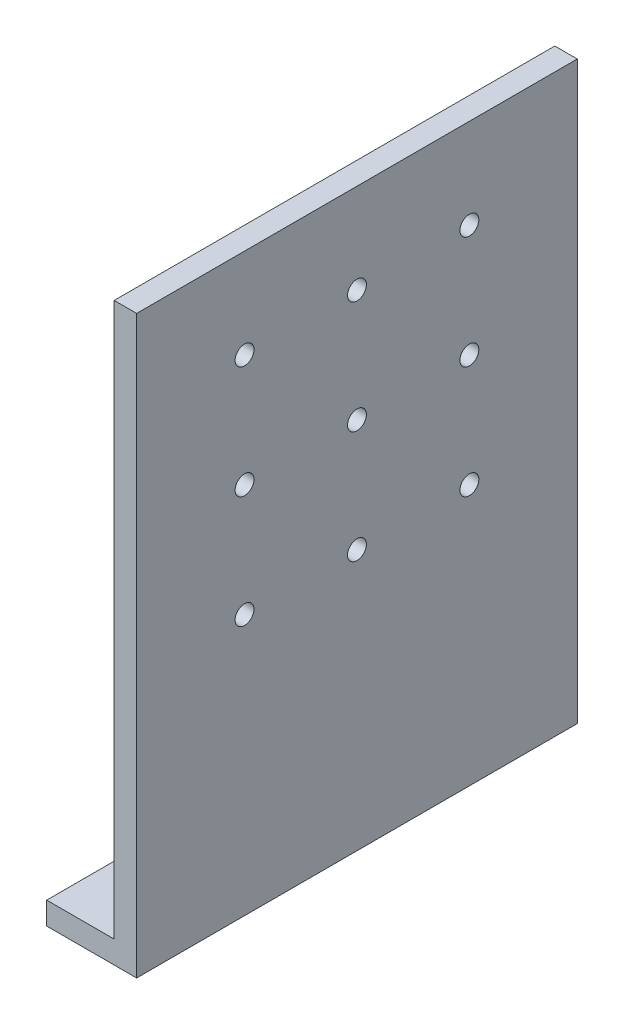
ISO-10303-21;
HEADER;
FILE_DESCRIPTION(('STEP AP214'),'2;1');
FILE_NAME('part.step','',(''),(''),'','','');
FILE_SCHEMA(('AUTOMOTIVE_DESIGN { 1 0 10303 214 1 1 1 1 }'));
ENDSEC;
DATA;
#1=APPLICATION_CONTEXT('core data for automotive mechanical design processes');
#2=APPLICATION_PROTOCOL_DEFINITION('international standard','automotive_design',2000,#1);
#3=PRODUCT_CONTEXT('',#1,'mechanical');
#4=PRODUCT('Part','Part','',(#3));
#5=PRODUCT_RELATED_PRODUCT_CATEGORY('part','',(#4));
#6=PRODUCT_DEFINITION_FORMATION('','',#4);
#7=PRODUCT_DEFINITION_CONTEXT('part definition',#1,'design');
#8=PRODUCT_DEFINITION('design','',#6,#7);
#9=PRODUCT_DEFINITION_SHAPE('','',#8);
#10=(LENGTH_UNIT() NAMED_UNIT(*) SI_UNIT(.MILLI.,.METRE.));
#11=(NAMED_UNIT(*) PLANE_ANGLE_UNIT() SI_UNIT($,.RADIAN.));
#12=(NAMED_UNIT(*) SI_UNIT($,.STERADIAN.) SOLID_ANGLE_UNIT());
#13=UNCERTAINTY_MEASURE_WITH_UNIT(LENGTH_MEASURE(1.E-05),#10,'distance_accuracy_value','');
#14=(GEOMETRIC_REPRESENTATION_CONTEXT(3) GLOBAL_UNCERTAINTY_ASSIGNED_CONTEXT((#13)) GLOBAL_UNIT_ASSIGNED_CONTEXT((#10,
#11,#12)) REPRESENTATION_CONTEXT('',''));
#15=CARTESIAN_POINT('',(0.,0.,0.));
#16=DIRECTION('',(0.,0.,1.));
#17=DIRECTION('',(1.,0.,0.));
#18=AXIS2_PLACEMENT_3D('',#15,#16,#17);
#19=CARTESIAN_POINT('',(-20.,0.,98.));
#20=DIRECTION('',(0.,1.,0.));
#21=DIRECTION('',(0.,0.,1.));
#22=AXIS2_PLACEMENT_3D('',#19,#20,#21);
#23=PLANE('',#22);
#24=CARTESIAN_POINT('',(-12.5,0.,24.));
#25=DIRECTION('',(0.,1.,0.));
#26=DIRECTION('',(0.,0.,1.));
#27=AXIS2_PLACEMENT_3D('',#24,#25,#26);
#28=CIRCLE('',#27,2.1);
#29=CARTESIAN_POINT('',(-12.5,0.,26.1));
#30=VERTEX_POINT('',#29);
#31=EDGE_CURVE('E187',#30,#30,#28,.T.);
#32=ORIENTED_EDGE('',*,*,#31,.T.);
#33=EDGE_LOOP('',(#32));
#34=FACE_BOUND('',#33,.T.);
#35=CARTESIAN_POINT('',(-12.5,0.,74.));
#36=DIRECTION('',(0.,1.,0.));
#37=DIRECTION('',(0.,0.,1.));
#38=AXIS2_PLACEMENT_3D('',#35,#36,#37);
#39=CIRCLE('',#38,2.1);
#40=CARTESIAN_POINT('',(-12.5,0.,76.1));
#41=VERTEX_POINT('',#40);
#42=EDGE_CURVE('E137',#41,#41,#39,.T.);
#43=ORIENTED_EDGE('',*,*,#42,.T.);
#44=EDGE_LOOP('',(#43));
#45=FACE_BOUND('',#44,.T.);
#46=DIRECTION('',(1.,0.,0.));
#47=VECTOR('',#46,1.);
#48=CARTESIAN_POINT('',(-20.,0.,0.));
#49=LINE('',#48,#47);
#50=CARTESIAN_POINT('',(-20.,0.,0.));
#51=VERTEX_POINT('',#50);
#52=CARTESIAN_POINT('',(0.,0.,0.));
#53=VERTEX_POINT('',#52);
#54=EDGE_CURVE('E132',#51,#53,#49,.T.);
#55=ORIENTED_EDGE('',*,*,#54,.T.);
#56=DIRECTION('',(0.,0.,-1.));
#57=VECTOR('',#56,1.);
#58=CARTESIAN_POINT('',(0.,0.,98.));
#59=LINE('',#58,#57);
#60=CARTESIAN_POINT('',(0.,0.,98.));
#61=VERTEX_POINT('',#60);
#62=EDGE_CURVE('E11',#61,#53,#59,.T.);
#63=ORIENTED_EDGE('',*,*,#62,.F.);
#64=DIRECTION('',(1.,0.,0.));
#65=VECTOR('',#64,1.);
#66=CARTESIAN_POINT('',(-20.,0.,98.));
#67=LINE('',#66,#65);
#68=CARTESIAN_POINT('',(-20.,0.,98.));
#69=VERTEX_POINT('',#68);
#70=EDGE_CURVE('E149',#69,#61,#67,.T.);
#71=ORIENTED_EDGE('',*,*,#70,.F.);
#72=DIRECTION('',(0.,0.,-1.));
#73=VECTOR('',#72,1.);
#74=CARTESIAN_POINT('',(-20.,0.,98.));
#75=LINE('',#74,#73);
#76=EDGE_CURVE('E128',#69,#51,#75,.T.);
#77=ORIENTED_EDGE('',*,*,#76,.T.);
#78=EDGE_LOOP('',(#55,#63,#71,#77));
#79=FACE_BOUND('',#78,.T.);
#80=ADVANCED_FACE('F43',(#34,#45,#79),#23,.F.);
#81=CARTESIAN_POINT('',(0.,0.,98.));
#82=DIRECTION('',(-1.,0.,0.));
#83=DIRECTION('',(0.,0.,1.));
#84=AXIS2_PLACEMENT_3D('',#81,#82,#83);
#85=PLANE('',#84);
#86=CARTESIAN_POINT('',(0.,58.,24.));
#87=DIRECTION('',(-1.,0.,0.));
#88=DIRECTION('',(0.,0.,1.));
#89=AXIS2_PLACEMENT_3D('',#86,#87,#88);
#90=CIRCLE('',#89,2.09999999999999);
#91=CARTESIAN_POINT('',(0.,58.,26.1));
#92=VERTEX_POINT('',#91);
#93=EDGE_CURVE('E273',#92,#92,#90,.T.);
#94=ORIENTED_EDGE('',*,*,#93,.T.);
#95=EDGE_LOOP('',(#94));
#96=FACE_BOUND('',#95,.T.);
#97=CARTESIAN_POINT('',(0.,58.,49.));
#98=DIRECTION('',(-1.,0.,0.));
#99=DIRECTION('',(0.,0.,1.));
#100=AXIS2_PLACEMENT_3D('',#97,#98,#99);
#101=CIRCLE('',#100,2.09999999999999);
#102=CARTESIAN_POINT('',(0.,58.,51.1));
#103=VERTEX_POINT('',#102);
#104=EDGE_CURVE('E265',#103,#103,#101,.T.);
#105=ORIENTED_EDGE('',*,*,#104,.T.);
#106=EDGE_LOOP('',(#105));
#107=FACE_BOUND('',#106,.T.);
#108=CARTESIAN_POINT('',(0.,58.,74.));
#109=DIRECTION('',(-1.,0.,0.));
#110=DIRECTION('',(0.,0.,1.));
#111=AXIS2_PLACEMENT_3D('',#108,#109,#110);
#112=CIRCLE('',#111,2.09999999999999);
#113=CARTESIAN_POINT('',(0.,58.,76.1));
#114=VERTEX_POINT('',#113);
#115=EDGE_CURVE('E257',#114,#114,#112,.T.);
#116=ORIENTED_EDGE('',*,*,#115,.T.);
#117=EDGE_LOOP('',(#116));
#118=FACE_BOUND('',#117,.T.);
#119=CARTESIAN_POINT('',(0.,83.,74.));
#120=DIRECTION('',(-1.,0.,0.));
#121=DIRECTION('',(0.,0.,1.));
#122=AXIS2_PLACEMENT_3D('',#119,#120,#121);
#123=CIRCLE('',#122,2.09999999999999);
#124=CARTESIAN_POINT('',(0.,83.,76.1));
#125=VERTEX_POINT('',#124);
#126=EDGE_CURVE('E249',#125,#125,#123,.T.);
#127=ORIENTED_EDGE('',*,*,#126,.T.);
#128=EDGE_LOOP('',(#127));
#129=FACE_BOUND('',#128,.T.);
#130=CARTESIAN_POINT('',(0.,108.,74.));
#131=DIRECTION('',(-1.,0.,0.));
#132=DIRECTION('',(0.,0.,1.));
#133=AXIS2_PLACEMENT_3D('',#130,#131,#132);
#134=CIRCLE('',#133,2.09999999999999);
#135=CARTESIAN_POINT('',(0.,108.,76.1));
#136=VERTEX_POINT('',#135);
#137=EDGE_CURVE('E241',#136,#136,#134,.T.);
#138=ORIENTED_EDGE('',*,*,#137,.T.);
#139=EDGE_LOOP('',(#138));
#140=FACE_BOUND('',#139,.T.);
#141=CARTESIAN_POINT('',(0.,108.,49.));
#142=DIRECTION('',(-1.,0.,0.));
#143=DIRECTION('',(0.,0.,1.));
#144=AXIS2_PLACEMENT_3D('',#141,#142,#143);
#145=CIRCLE('',#144,2.09999999999999);
#146=CARTESIAN_POINT('',(0.,108.,51.1));
#147=VERTEX_POINT('',#146);
#148=EDGE_CURVE('E233',#147,#147,#145,.T.);
#149=ORIENTED_EDGE('',*,*,#148,.T.);
#150=EDGE_LOOP('',(#149));
#151=FACE_BOUND('',#150,.T.);
#152=CARTESIAN_POINT('',(0.,108.,24.));
#153=DIRECTION('',(-1.,0.,0.));
#154=DIRECTION('',(0.,0.,1.));
#155=AXIS2_PLACEMENT_3D('',#152,#153,#154);
#156=CIRCLE('',#155,2.09999999999999);
#157=CARTESIAN_POINT('',(0.,108.,26.1));
#158=VERTEX_POINT('',#157);
#159=EDGE_CURVE('E225',#158,#158,#156,.T.);
#160=ORIENTED_EDGE('',*,*,#159,.T.);
#161=EDGE_LOOP('',(#160));
#162=FACE_BOUND('',#161,.T.);
#163=CARTESIAN_POINT('',(0.,83.,24.));
#164=DIRECTION('',(-1.,0.,0.));
#165=DIRECTION('',(0.,0.,1.));
#166=AXIS2_PLACEMENT_3D('',#163,#164,#165);
#167=CIRCLE('',#166,2.09999999999999);
#168=CARTESIAN_POINT('',(0.,83.,26.1));
#169=VERTEX_POINT('',#168);
#170=EDGE_CURVE('E217',#169,#169,#167,.T.);
#171=ORIENTED_EDGE('',*,*,#170,.T.);
#172=EDGE_LOOP('',(#171));
#173=FACE_BOUND('',#172,.T.);
#174=CARTESIAN_POINT('',(0.,83.,49.));
#175=DIRECTION('',(-1.,0.,0.));
#176=DIRECTION('',(0.,0.,1.));
#177=AXIS2_PLACEMENT_3D('',#174,#175,#176);
#178=CIRCLE('',#177,2.09999999999999);
#179=CARTESIAN_POINT('',(0.,83.,51.1));
#180=VERTEX_POINT('',#179);
#181=EDGE_CURVE('E209',#180,#180,#178,.T.);
#182=ORIENTED_EDGE('',*,*,#181,.T.);
#183=EDGE_LOOP('',(#182));
#184=FACE_BOUND('',#183,.T.);
#185=DIRECTION('',(0.,1.,0.));
#186=VECTOR('',#185,1.);
#187=CARTESIAN_POINT('',(0.,0.,0.));
#188=LINE('',#187,#186);
#189=CARTESIAN_POINT('',(0.,128.,0.));
#190=VERTEX_POINT('',#189);
#191=EDGE_CURVE('E136',#53,#190,#188,.T.);
#192=ORIENTED_EDGE('',*,*,#191,.T.);
#193=DIRECTION('',(0.,0.,-1.));
#194=VECTOR('',#193,1.);
#195=CARTESIAN_POINT('',(0.,128.,98.));
#196=LINE('',#195,#194);
#197=CARTESIAN_POINT('',(0.,128.,98.));
#198=VERTEX_POINT('',#197);
#199=EDGE_CURVE('E52',#198,#190,#196,.T.);
#200=ORIENTED_EDGE('',*,*,#199,.F.);
#201=DIRECTION('',(0.,1.,0.));
#202=VECTOR('',#201,1.);
#203=CARTESIAN_POINT('',(0.,0.,98.));
#204=LINE('',#203,#202);
#205=EDGE_CURVE('E97',#61,#198,#204,.T.);
#206=ORIENTED_EDGE('',*,*,#205,.F.);
#207=ORIENTED_EDGE('',*,*,#62,.T.);
#208=EDGE_LOOP('',(#192,#200,#206,#207));
#209=FACE_BOUND('',#208,.T.);
#210=ADVANCED_FACE('F178',(#96,#107,#118,#129,#140,#151,#162,#173,#184,#209),#85,.F.);
#211=CARTESIAN_POINT('',(0.,128.,98.));
#212=DIRECTION('',(0.,-1.,0.));
#213=DIRECTION('',(0.,0.,-1.));
#214=AXIS2_PLACEMENT_3D('',#211,#212,#213);
#215=PLANE('',#214);
#216=DIRECTION('',(-1.,0.,0.));
#217=VECTOR('',#216,1.);
#218=CARTESIAN_POINT('',(0.,128.,0.));
#219=LINE('',#218,#217);
#220=CARTESIAN_POINT('',(-5.,128.,0.));
#221=VERTEX_POINT('',#220);
#222=EDGE_CURVE('E140',#190,#221,#219,.T.);
#223=ORIENTED_EDGE('',*,*,#222,.T.);
#224=DIRECTION('',(0.,0.,-1.));
#225=VECTOR('',#224,1.);
#226=CARTESIAN_POINT('',(-5.,128.,98.));
#227=LINE('',#226,#225);
#228=CARTESIAN_POINT('',(-5.,128.,98.));
#229=VERTEX_POINT('',#228);
#230=EDGE_CURVE('E121',#229,#221,#227,.T.);
#231=ORIENTED_EDGE('',*,*,#230,.F.);
#232=DIRECTION('',(-1.,0.,0.));
#233=VECTOR('',#232,1.);
#234=CARTESIAN_POINT('',(0.,128.,98.));
#235=LINE('',#234,#233);
#236=EDGE_CURVE('E110',#198,#229,#235,.T.);
#237=ORIENTED_EDGE('',*,*,#236,.F.);
#238=ORIENTED_EDGE('',*,*,#199,.T.);
#239=EDGE_LOOP('',(#223,#231,#237,#238));
#240=FACE_BOUND('',#239,.T.);
#241=ADVANCED_FACE('F159',(#240),#215,.F.);
#242=CARTESIAN_POINT('',(-5.,128.,98.));
#243=DIRECTION('',(1.,0.,0.));
#244=DIRECTION('',(0.,1.,0.));
#245=AXIS2_PLACEMENT_3D('',#242,#243,#244);
#246=PLANE('',#245);
#247=CARTESIAN_POINT('',(-4.99999999999999,58.,24.));
#248=DIRECTION('',(-1.,0.,0.));
#249=DIRECTION('',(0.,0.,1.));
#250=AXIS2_PLACEMENT_3D('',#247,#248,#249);
#251=CIRCLE('',#250,2.09999999999999);
#252=CARTESIAN_POINT('',(-4.99999999999999,58.,26.1));
#253=VERTEX_POINT('',#252);
#254=EDGE_CURVE('E277',#253,#253,#251,.T.);
#255=ORIENTED_EDGE('',*,*,#254,.F.);
#256=EDGE_LOOP('',(#255));
#257=FACE_BOUND('',#256,.T.);
#258=CARTESIAN_POINT('',(-4.99999999999999,58.,49.));
#259=DIRECTION('',(-1.,0.,0.));
#260=DIRECTION('',(0.,0.,1.));
#261=AXIS2_PLACEMENT_3D('',#258,#259,#260);
#262=CIRCLE('',#261,2.09999999999999);
#263=CARTESIAN_POINT('',(-4.99999999999999,58.,51.1));
#264=VERTEX_POINT('',#263);
#265=EDGE_CURVE('E269',#264,#264,#262,.T.);
#266=ORIENTED_EDGE('',*,*,#265,.F.);
#267=EDGE_LOOP('',(#266));
#268=FACE_BOUND('',#267,.T.);
#269=CARTESIAN_POINT('',(-4.99999999999999,58.,74.));
#270=DIRECTION('',(-1.,0.,0.));
#271=DIRECTION('',(0.,0.,1.));
#272=AXIS2_PLACEMENT_3D('',#269,#270,#271);
#273=CIRCLE('',#272,2.09999999999999);
#274=CARTESIAN_POINT('',(-4.99999999999999,58.,76.1));
#275=VERTEX_POINT('',#274);
#276=EDGE_CURVE('E261',#275,#275,#273,.T.);
#277=ORIENTED_EDGE('',*,*,#276,.F.);
#278=EDGE_LOOP('',(#277));
#279=FACE_BOUND('',#278,.T.);
#280=CARTESIAN_POINT('',(-5.,83.,74.));
#281=DIRECTION('',(-1.,0.,0.));
#282=DIRECTION('',(0.,0.,1.));
#283=AXIS2_PLACEMENT_3D('',#280,#281,#282);
#284=CIRCLE('',#283,2.09999999999999);
#285=CARTESIAN_POINT('',(-5.,83.,76.1));
#286=VERTEX_POINT('',#285);
#287=EDGE_CURVE('E253',#286,#286,#284,.T.);
#288=ORIENTED_EDGE('',*,*,#287,.F.);
#289=EDGE_LOOP('',(#288));
#290=FACE_BOUND('',#289,.T.);
#291=CARTESIAN_POINT('',(-5.,108.,74.));
#292=DIRECTION('',(-1.,0.,0.));
#293=DIRECTION('',(0.,0.,1.));
#294=AXIS2_PLACEMENT_3D('',#291,#292,#293);
#295=CIRCLE('',#294,2.09999999999999);
#296=CARTESIAN_POINT('',(-5.,108.,76.1));
#297=VERTEX_POINT('',#296);
#298=EDGE_CURVE('E245',#297,#297,#295,.T.);
#299=ORIENTED_EDGE('',*,*,#298,.F.);
#300=EDGE_LOOP('',(#299));
#301=FACE_BOUND('',#300,.T.);
#302=CARTESIAN_POINT('',(-5.,108.,49.));
#303=DIRECTION('',(-1.,0.,0.));
#304=DIRECTION('',(0.,0.,1.));
#305=AXIS2_PLACEMENT_3D('',#302,#303,#304);
#306=CIRCLE('',#305,2.09999999999999);
#307=CARTESIAN_POINT('',(-5.,108.,51.1));
#308=VERTEX_POINT('',#307);
#309=EDGE_CURVE('E237',#308,#308,#306,.T.);
#310=ORIENTED_EDGE('',*,*,#309,.F.);
#311=EDGE_LOOP('',(#310));
#312=FACE_BOUND('',#311,.T.);
#313=CARTESIAN_POINT('',(-5.,108.,24.));
#314=DIRECTION('',(-1.,0.,0.));
#315=DIRECTION('',(0.,0.,1.));
#316=AXIS2_PLACEMENT_3D('',#313,#314,#315);
#317=CIRCLE('',#316,2.09999999999999);
#318=CARTESIAN_POINT('',(-5.,108.,26.1));
#319=VERTEX_POINT('',#318);
#320=EDGE_CURVE('E229',#319,#319,#317,.T.);
#321=ORIENTED_EDGE('',*,*,#320,.F.);
#322=EDGE_LOOP('',(#321));
#323=FACE_BOUND('',#322,.T.);
#324=CARTESIAN_POINT('',(-5.,83.,24.));
#325=DIRECTION('',(-1.,0.,0.));
#326=DIRECTION('',(0.,0.,1.));
#327=AXIS2_PLACEMENT_3D('',#324,#325,#326);
#328=CIRCLE('',#327,2.09999999999999);
#329=CARTESIAN_POINT('',(-5.,83.,26.1));
#330=VERTEX_POINT('',#329);
#331=EDGE_CURVE('E221',#330,#330,#328,.T.);
#332=ORIENTED_EDGE('',*,*,#331,.F.);
#333=EDGE_LOOP('',(#332));
#334=FACE_BOUND('',#333,.T.);
#335=CARTESIAN_POINT('',(-5.,83.,49.));
#336=DIRECTION('',(-1.,0.,0.));
#337=DIRECTION('',(0.,0.,1.));
#338=AXIS2_PLACEMENT_3D('',#335,#336,#337);
#339=CIRCLE('',#338,2.09999999999999);
#340=CARTESIAN_POINT('',(-5.,83.,51.1));
#341=VERTEX_POINT('',#340);
#342=EDGE_CURVE('E213',#341,#341,#339,.T.);
#343=ORIENTED_EDGE('',*,*,#342,.F.);
#344=EDGE_LOOP('',(#343));
#345=FACE_BOUND('',#344,.T.);
#346=DIRECTION('',(0.,-1.,0.));
#347=VECTOR('',#346,1.);
#348=CARTESIAN_POINT('',(-5.,128.,0.));
#349=LINE('',#348,#347);
#350=CARTESIAN_POINT('',(-4.99999999999998,5.,0.));
#351=VERTEX_POINT('',#350);
#352=EDGE_CURVE('E119',#221,#351,#349,.T.);
#353=ORIENTED_EDGE('',*,*,#352,.T.);
#354=DIRECTION('',(0.,0.,-1.));
#355=VECTOR('',#354,1.);
#356=CARTESIAN_POINT('',(-4.99999999999998,5.,98.));
#357=LINE('',#356,#355);
#358=CARTESIAN_POINT('',(-4.99999999999998,5.,98.));
#359=VERTEX_POINT('',#358);
#360=EDGE_CURVE('E116',#359,#351,#357,.T.);
#361=ORIENTED_EDGE('',*,*,#360,.F.);
#362=DIRECTION('',(0.,-1.,0.));
#363=VECTOR('',#362,1.);
#364=CARTESIAN_POINT('',(-5.,128.,98.));
#365=LINE('',#364,#363);
#366=EDGE_CURVE('E104',#229,#359,#365,.T.);
#367=ORIENTED_EDGE('',*,*,#366,.F.);
#368=ORIENTED_EDGE('',*,*,#230,.T.);
#369=EDGE_LOOP('',(#353,#361,#367,#368));
#370=FACE_BOUND('',#369,.T.);
#371=ADVANCED_FACE('F117',(#257,#268,#279,#290,#301,#312,#323,#334,#345,#370),#246,.F.);
#372=CARTESIAN_POINT('',(-4.99999999999998,5.,98.));
#373=DIRECTION('',(0.,-1.,0.));
#374=DIRECTION('',(1.,0.,0.));
#375=AXIS2_PLACEMENT_3D('',#372,#373,#374);
#376=PLANE('',#375);
#377=CARTESIAN_POINT('',(-12.5,5.,24.));
#378=DIRECTION('',(0.,1.,0.));
#379=DIRECTION('',(0.,0.,1.));
#380=AXIS2_PLACEMENT_3D('',#377,#378,#379);
#381=CIRCLE('',#380,2.1);
#382=CARTESIAN_POINT('',(-12.5,5.,26.1));
#383=VERTEX_POINT('',#382);
#384=EDGE_CURVE('E205',#383,#383,#381,.T.);
#385=ORIENTED_EDGE('',*,*,#384,.F.);
#386=EDGE_LOOP('',(#385));
#387=FACE_BOUND('',#386,.T.);
#388=CARTESIAN_POINT('',(-12.5,5.,74.));
#389=DIRECTION('',(0.,1.,0.));
#390=DIRECTION('',(0.,0.,1.));
#391=AXIS2_PLACEMENT_3D('',#388,#389,#390);
#392=CIRCLE('',#391,2.1);
#393=CARTESIAN_POINT('',(-12.5,5.,76.1));
#394=VERTEX_POINT('',#393);
#395=EDGE_CURVE('E192',#394,#394,#392,.T.);
#396=ORIENTED_EDGE('',*,*,#395,.F.);
#397=EDGE_LOOP('',(#396));
#398=FACE_BOUND('',#397,.T.);
#399=DIRECTION('',(-1.,0.,0.));
#400=VECTOR('',#399,1.);
#401=CARTESIAN_POINT('',(-4.99999999999998,5.,0.));
#402=LINE('',#401,#400);
#403=CARTESIAN_POINT('',(-20.,5.,0.));
#404=VERTEX_POINT('',#403);
#405=EDGE_CURVE('E83',#351,#404,#402,.T.);
#406=ORIENTED_EDGE('',*,*,#405,.T.);
#407=DIRECTION('',(0.,0.,-1.));
#408=VECTOR('',#407,1.);
#409=CARTESIAN_POINT('',(-20.,5.,98.));
#410=LINE('',#409,#408);
#411=CARTESIAN_POINT('',(-20.,5.,98.));
#412=VERTEX_POINT('',#411);
#413=EDGE_CURVE('E122',#412,#404,#410,.T.);
#414=ORIENTED_EDGE('',*,*,#413,.F.);
#415=DIRECTION('',(-1.,0.,0.));
#416=VECTOR('',#415,1.);
#417=CARTESIAN_POINT('',(-4.99999999999998,5.,98.));
#418=LINE('',#417,#416);
#419=EDGE_CURVE('E108',#359,#412,#418,.T.);
#420=ORIENTED_EDGE('',*,*,#419,.F.);
#421=ORIENTED_EDGE('',*,*,#360,.T.);
#422=EDGE_LOOP('',(#406,#414,#420,#421));
#423=FACE_BOUND('',#422,.T.);
#424=ADVANCED_FACE('F124',(#387,#398,#423),#376,.F.);
#425=CARTESIAN_POINT('',(-20.,5.,98.));
#426=DIRECTION('',(1.,0.,0.));
#427=DIRECTION('',(0.,1.,0.));
#428=AXIS2_PLACEMENT_3D('',#425,#426,#427);
#429=PLANE('',#428);
#430=DIRECTION('',(0.,-1.,0.));
#431=VECTOR('',#430,1.);
#432=CARTESIAN_POINT('',(-20.,5.,0.));
#433=LINE('',#432,#431);
#434=EDGE_CURVE('E89',#404,#51,#433,.T.);
#435=ORIENTED_EDGE('',*,*,#434,.T.);
#436=ORIENTED_EDGE('',*,*,#76,.F.);
#437=DIRECTION('',(0.,-1.,0.));
#438=VECTOR('',#437,1.);
#439=CARTESIAN_POINT('',(-20.,5.,98.));
#440=LINE('',#439,#438);
#441=EDGE_CURVE('E60',#412,#69,#440,.T.);
#442=ORIENTED_EDGE('',*,*,#441,.F.);
#443=ORIENTED_EDGE('',*,*,#413,.T.);
#444=EDGE_LOOP('',(#435,#436,#442,#443));
#445=FACE_BOUND('',#444,.T.);
#446=ADVANCED_FACE('F166',(#445),#429,.F.);
#447=CARTESIAN_POINT('',(0.,0.,98.));
#448=DIRECTION('',(0.,0.,1.));
#449=DIRECTION('',(1.,0.,0.));
#450=AXIS2_PLACEMENT_3D('',#447,#448,#449);
#451=PLANE('',#450);
#452=ORIENTED_EDGE('',*,*,#70,.T.);
#453=ORIENTED_EDGE('',*,*,#205,.T.);
#454=ORIENTED_EDGE('',*,*,#236,.T.);
#455=ORIENTED_EDGE('',*,*,#366,.T.);
#456=ORIENTED_EDGE('',*,*,#419,.T.);
#457=ORIENTED_EDGE('',*,*,#441,.T.);
#458=EDGE_LOOP('',(#452,#453,#454,#455,#456,#457));
#459=FACE_BOUND('',#458,.T.);
#460=ADVANCED_FACE('F106',(#459),#451,.T.);
#461=CARTESIAN_POINT('',(0.,0.,0.));
#462=DIRECTION('',(0.,0.,1.));
#463=DIRECTION('',(1.,0.,0.));
#464=AXIS2_PLACEMENT_3D('',#461,#462,#463);
#465=PLANE('',#464);
#466=ORIENTED_EDGE('',*,*,#54,.F.);
#467=ORIENTED_EDGE('',*,*,#434,.F.);
#468=ORIENTED_EDGE('',*,*,#405,.F.);
#469=ORIENTED_EDGE('',*,*,#352,.F.);
#470=ORIENTED_EDGE('',*,*,#222,.F.);
#471=ORIENTED_EDGE('',*,*,#191,.F.);
#472=EDGE_LOOP('',(#466,#467,#468,#469,#470,#471));
#473=FACE_BOUND('',#472,.T.);
#474=ADVANCED_FACE('F162',(#473),#465,.F.);
#475=CARTESIAN_POINT('',(-12.5,5.,74.));
#476=DIRECTION('',(0.,1.,0.));
#477=DIRECTION('',(0.,0.,1.));
#478=AXIS2_PLACEMENT_3D('',#475,#476,#477);
#479=CYLINDRICAL_SURFACE('',#478,2.1);
#480=ORIENTED_EDGE('',*,*,#395,.T.);
#481=EDGE_LOOP('',(#480));
#482=FACE_BOUND('',#481,.T.);
#483=ORIENTED_EDGE('',*,*,#42,.F.);
#484=EDGE_LOOP('',(#483));
#485=FACE_BOUND('',#484,.T.);
#486=ADVANCED_FACE('F319',(#482,#485),#479,.F.);
#487=CARTESIAN_POINT('',(-12.5,5.,24.));
#488=DIRECTION('',(0.,1.,0.));
#489=DIRECTION('',(0.,0.,1.));
#490=AXIS2_PLACEMENT_3D('',#487,#488,#489);
#491=CYLINDRICAL_SURFACE('',#490,2.1);
#492=ORIENTED_EDGE('',*,*,#384,.T.);
#493=EDGE_LOOP('',(#492));
#494=FACE_BOUND('',#493,.T.);
#495=ORIENTED_EDGE('',*,*,#31,.F.);
#496=EDGE_LOOP('',(#495));
#497=FACE_BOUND('',#496,.T.);
#498=ADVANCED_FACE('F308',(#494,#497),#491,.F.);
#499=CARTESIAN_POINT('',(-4.99999999999999,83.,49.));
#500=DIRECTION('',(-1.,0.,0.));
#501=DIRECTION('',(0.,0.,1.));
#502=AXIS2_PLACEMENT_3D('',#499,#500,#501);
#503=CYLINDRICAL_SURFACE('',#502,2.09999999999999);
#504=ORIENTED_EDGE('',*,*,#342,.T.);
#505=EDGE_LOOP('',(#504));
#506=FACE_BOUND('',#505,.T.);
#507=ORIENTED_EDGE('',*,*,#181,.F.);
#508=EDGE_LOOP('',(#507));
#509=FACE_BOUND('',#508,.T.);
#510=ADVANCED_FACE('F304',(#506,#509),#503,.F.);
#511=CARTESIAN_POINT('',(-4.99999999999999,83.,24.));
#512=DIRECTION('',(-1.,0.,0.));
#513=DIRECTION('',(0.,0.,1.));
#514=AXIS2_PLACEMENT_3D('',#511,#512,#513);
#515=CYLINDRICAL_SURFACE('',#514,2.09999999999999);
#516=ORIENTED_EDGE('',*,*,#331,.T.);
#517=EDGE_LOOP('',(#516));
#518=FACE_BOUND('',#517,.T.);
#519=ORIENTED_EDGE('',*,*,#170,.F.);
#520=EDGE_LOOP('',(#519));
#521=FACE_BOUND('',#520,.T.);
#522=ADVANCED_FACE('F307',(#518,#521),#515,.F.);
#523=CARTESIAN_POINT('',(-5.,108.,24.));
#524=DIRECTION('',(-1.,0.,0.));
#525=DIRECTION('',(0.,0.,1.));
#526=AXIS2_PLACEMENT_3D('',#523,#524,#525);
#527=CYLINDRICAL_SURFACE('',#526,2.09999999999999);
#528=ORIENTED_EDGE('',*,*,#320,.T.);
#529=EDGE_LOOP('',(#528));
#530=FACE_BOUND('',#529,.T.);
#531=ORIENTED_EDGE('',*,*,#159,.F.);
#532=EDGE_LOOP('',(#531));
#533=FACE_BOUND('',#532,.T.);
#534=ADVANCED_FACE('F316',(#530,#533),#527,.F.);
#535=CARTESIAN_POINT('',(-5.,108.,49.));
#536=DIRECTION('',(-1.,0.,0.));
#537=DIRECTION('',(0.,0.,1.));
#538=AXIS2_PLACEMENT_3D('',#535,#536,#537);
#539=CYLINDRICAL_SURFACE('',#538,2.09999999999999);
#540=ORIENTED_EDGE('',*,*,#309,.T.);
#541=EDGE_LOOP('',(#540));
#542=FACE_BOUND('',#541,.T.);
#543=ORIENTED_EDGE('',*,*,#148,.F.);
#544=EDGE_LOOP('',(#543));
#545=FACE_BOUND('',#544,.T.);
#546=ADVANCED_FACE('F372',(#542,#545),#539,.F.);
#547=CARTESIAN_POINT('',(-5.,108.,74.));
#548=DIRECTION('',(-1.,0.,0.));
#549=DIRECTION('',(0.,0.,1.));
#550=AXIS2_PLACEMENT_3D('',#547,#548,#549);
#551=CYLINDRICAL_SURFACE('',#550,2.09999999999999);
#552=ORIENTED_EDGE('',*,*,#298,.T.);
#553=EDGE_LOOP('',(#552));
#554=FACE_BOUND('',#553,.T.);
#555=ORIENTED_EDGE('',*,*,#137,.F.);
#556=EDGE_LOOP('',(#555));
#557=FACE_BOUND('',#556,.T.);
#558=ADVANCED_FACE('F379',(#554,#557),#551,.F.);
#559=CARTESIAN_POINT('',(-4.99999999999999,83.,74.));
#560=DIRECTION('',(-1.,0.,0.));
#561=DIRECTION('',(0.,0.,1.));
#562=AXIS2_PLACEMENT_3D('',#559,#560,#561);
#563=CYLINDRICAL_SURFACE('',#562,2.09999999999999);
#564=ORIENTED_EDGE('',*,*,#287,.T.);
#565=EDGE_LOOP('',(#564));
#566=FACE_BOUND('',#565,.T.);
#567=ORIENTED_EDGE('',*,*,#126,.F.);
#568=EDGE_LOOP('',(#567));
#569=FACE_BOUND('',#568,.T.);
#570=ADVANCED_FACE('F389',(#566,#569),#563,.F.);
#571=CARTESIAN_POINT('',(-4.99999999999999,58.,74.));
#572=DIRECTION('',(-1.,0.,0.));
#573=DIRECTION('',(0.,0.,1.));
#574=AXIS2_PLACEMENT_3D('',#571,#572,#573);
#575=CYLINDRICAL_SURFACE('',#574,2.09999999999999);
#576=ORIENTED_EDGE('',*,*,#276,.T.);
#577=EDGE_LOOP('',(#576));
#578=FACE_BOUND('',#577,.T.);
#579=ORIENTED_EDGE('',*,*,#115,.F.);
#580=EDGE_LOOP('',(#579));
#581=FACE_BOUND('',#580,.T.);
#582=ADVANCED_FACE('F399',(#578,#581),#575,.F.);
#583=CARTESIAN_POINT('',(-4.99999999999999,58.,49.));
#584=DIRECTION('',(-1.,0.,0.));
#585=DIRECTION('',(0.,0.,1.));
#586=AXIS2_PLACEMENT_3D('',#583,#584,#585);
#587=CYLINDRICAL_SURFACE('',#586,2.09999999999999);
#588=ORIENTED_EDGE('',*,*,#265,.T.);
#589=EDGE_LOOP('',(#588));
#590=FACE_BOUND('',#589,.T.);
#591=ORIENTED_EDGE('',*,*,#104,.F.);
#592=EDGE_LOOP('',(#591));
#593=FACE_BOUND('',#592,.T.);
#594=ADVANCED_FACE('F409',(#590,#593),#587,.F.);
#595=CARTESIAN_POINT('',(-4.99999999999999,58.,24.));
#596=DIRECTION('',(-1.,0.,0.));
#597=DIRECTION('',(0.,0.,1.));
#598=AXIS2_PLACEMENT_3D('',#595,#596,#597);
#599=CYLINDRICAL_SURFACE('',#598,2.09999999999999);
#600=ORIENTED_EDGE('',*,*,#254,.T.);
#601=EDGE_LOOP('',(#600));
#602=FACE_BOUND('',#601,.T.);
#603=ORIENTED_EDGE('',*,*,#93,.F.);
#604=EDGE_LOOP('',(#603));
#605=FACE_BOUND('',#604,.T.);
#606=ADVANCED_FACE('F282',(#602,#605),#599,.F.);
#607=CLOSED_SHELL('',(#80,#210,#241,#371,#424,#446,#460,#474,#486,#498,#510,#522,#534,#546,#558,
#570,#582,#594,#606));
#608=MANIFOLD_SOLID_BREP('B2',#607);
#609=ADVANCED_BREP_SHAPE_REPRESENTATION('',(#18,#608),#14);
#610=SHAPE_DEFINITION_REPRESENTATION(#9,#609);
ENDSEC;
END-ISO-10303-21;
